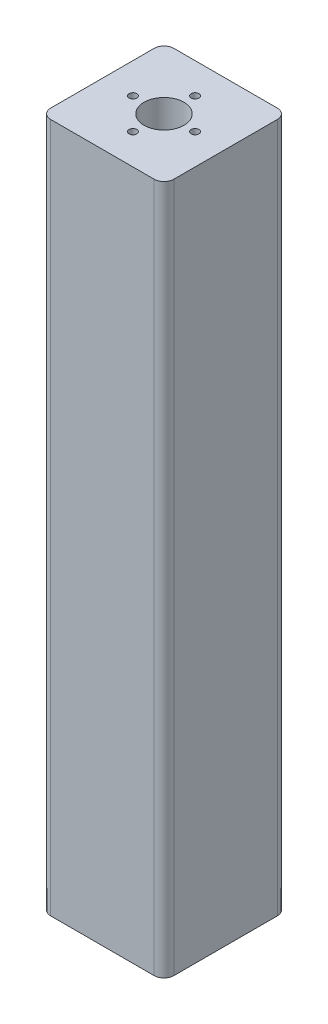
ISO-10303-21;
HEADER;
FILE_DESCRIPTION(('STEP AP214'),'2;1');
FILE_NAME('part.step','',(''),(''),'','','');
FILE_SCHEMA(('AUTOMOTIVE_DESIGN { 1 0 10303 214 1 1 1 1 }'));
ENDSEC;
DATA;
#1=APPLICATION_CONTEXT('core data for automotive mechanical design processes');
#2=APPLICATION_PROTOCOL_DEFINITION('international standard','automotive_design',2000,#1);
#3=PRODUCT_CONTEXT('',#1,'mechanical');
#4=PRODUCT('Part','Part','',(#3));
#5=PRODUCT_RELATED_PRODUCT_CATEGORY('part','',(#4));
#6=PRODUCT_DEFINITION_FORMATION('','',#4);
#7=PRODUCT_DEFINITION_CONTEXT('part definition',#1,'design');
#8=PRODUCT_DEFINITION('design','',#6,#7);
#9=PRODUCT_DEFINITION_SHAPE('','',#8);
#10=(LENGTH_UNIT() NAMED_UNIT(*) SI_UNIT(.MILLI.,.METRE.));
#11=(NAMED_UNIT(*) PLANE_ANGLE_UNIT() SI_UNIT($,.RADIAN.));
#12=(NAMED_UNIT(*) SI_UNIT($,.STERADIAN.) SOLID_ANGLE_UNIT());
#13=UNCERTAINTY_MEASURE_WITH_UNIT(LENGTH_MEASURE(1.E-05),#10,'distance_accuracy_value','');
#14=(GEOMETRIC_REPRESENTATION_CONTEXT(3) GLOBAL_UNCERTAINTY_ASSIGNED_CONTEXT((#13)) GLOBAL_UNIT_ASSIGNED_CONTEXT((#10,
#11,#12)) REPRESENTATION_CONTEXT('',''));
#15=CARTESIAN_POINT('',(0.,0.,0.));
#16=DIRECTION('',(0.,0.,1.));
#17=DIRECTION('',(1.,0.,0.));
#18=AXIS2_PLACEMENT_3D('',#15,#16,#17);
#19=CARTESIAN_POINT('',(-15.875,177.8,-15.875));
#20=DIRECTION('',(1.,0.,0.));
#21=DIRECTION('',(0.,0.,-1.));
#22=AXIS2_PLACEMENT_3D('',#19,#20,#21);
#23=PLANE('',#22);
#24=DIRECTION('',(0.,0.,1.));
#25=VECTOR('',#24,1.);
#26=CARTESIAN_POINT('',(-15.875,177.8,-15.875));
#27=LINE('',#26,#25);
#28=CARTESIAN_POINT('',(-15.875,177.8,-13.335));
#29=VERTEX_POINT('',#28);
#30=CARTESIAN_POINT('',(-15.875,177.8,13.335));
#31=VERTEX_POINT('',#30);
#32=EDGE_CURVE('E125',#29,#31,#27,.T.);
#33=ORIENTED_EDGE('',*,*,#32,.F.);
#34=DIRECTION('',(0.,-1.,0.));
#35=VECTOR('',#34,1.);
#36=CARTESIAN_POINT('',(-15.875,177.8,-13.335));
#37=LINE('',#36,#35);
#38=CARTESIAN_POINT('',(-15.875,0.,-13.335));
#39=VERTEX_POINT('',#38);
#40=EDGE_CURVE('E151',#29,#39,#37,.T.);
#41=ORIENTED_EDGE('',*,*,#40,.T.);
#42=DIRECTION('',(0.,0.,1.));
#43=VECTOR('',#42,1.);
#44=CARTESIAN_POINT('',(-15.875,0.,-15.875));
#45=LINE('',#44,#43);
#46=CARTESIAN_POINT('',(-15.875,0.,13.335));
#47=VERTEX_POINT('',#46);
#48=EDGE_CURVE('E160',#39,#47,#45,.T.);
#49=ORIENTED_EDGE('',*,*,#48,.T.);
#50=DIRECTION('',(0.,-1.,0.));
#51=VECTOR('',#50,1.);
#52=CARTESIAN_POINT('',(-15.875,177.8,13.335));
#53=LINE('',#52,#51);
#54=EDGE_CURVE('E149',#47,#31,#53,.F.);
#55=ORIENTED_EDGE('',*,*,#54,.T.);
#56=EDGE_LOOP('',(#33,#41,#49,#55));
#57=FACE_BOUND('',#56,.T.);
#58=ADVANCED_FACE('F33',(#57),#23,.F.);
#59=CARTESIAN_POINT('',(15.875,177.8,15.875));
#60=DIRECTION('',(0.,0.,-1.));
#61=DIRECTION('',(-1.,0.,0.));
#62=AXIS2_PLACEMENT_3D('',#59,#60,#61);
#63=PLANE('',#62);
#64=DIRECTION('',(1.,0.,0.));
#65=VECTOR('',#64,1.);
#66=CARTESIAN_POINT('',(15.875,0.,15.875));
#67=LINE('',#66,#65);
#68=CARTESIAN_POINT('',(-13.335,0.,15.875));
#69=VERTEX_POINT('',#68);
#70=CARTESIAN_POINT('',(13.335,0.,15.875));
#71=VERTEX_POINT('',#70);
#72=EDGE_CURVE('E130',#69,#71,#67,.T.);
#73=ORIENTED_EDGE('',*,*,#72,.T.);
#74=DIRECTION('',(0.,-1.,0.));
#75=VECTOR('',#74,1.);
#76=CARTESIAN_POINT('',(13.335,177.8,15.875));
#77=LINE('',#76,#75);
#78=CARTESIAN_POINT('',(13.335,177.8,15.875));
#79=VERTEX_POINT('',#78);
#80=EDGE_CURVE('E11',#71,#79,#77,.F.);
#81=ORIENTED_EDGE('',*,*,#80,.T.);
#82=DIRECTION('',(1.,0.,0.));
#83=VECTOR('',#82,1.);
#84=CARTESIAN_POINT('',(15.875,177.8,15.875));
#85=LINE('',#84,#83);
#86=CARTESIAN_POINT('',(-13.335,177.8,15.875));
#87=VERTEX_POINT('',#86);
#88=EDGE_CURVE('E128',#87,#79,#85,.T.);
#89=ORIENTED_EDGE('',*,*,#88,.F.);
#90=DIRECTION('',(0.,-1.,0.));
#91=VECTOR('',#90,1.);
#92=CARTESIAN_POINT('',(-13.335,177.8,15.875));
#93=LINE('',#92,#91);
#94=EDGE_CURVE('E42',#87,#69,#93,.T.);
#95=ORIENTED_EDGE('',*,*,#94,.T.);
#96=EDGE_LOOP('',(#73,#81,#89,#95));
#97=FACE_BOUND('',#96,.T.);
#98=ADVANCED_FACE('F157',(#97),#63,.F.);
#99=CARTESIAN_POINT('',(15.875,177.8,-15.875));
#100=DIRECTION('',(-1.,0.,0.));
#101=DIRECTION('',(0.,0.,1.));
#102=AXIS2_PLACEMENT_3D('',#99,#100,#101);
#103=PLANE('',#102);
#104=DIRECTION('',(0.,0.,-1.));
#105=VECTOR('',#104,1.);
#106=CARTESIAN_POINT('',(15.875,0.,-15.875));
#107=LINE('',#106,#105);
#108=CARTESIAN_POINT('',(15.875,0.,13.335));
#109=VERTEX_POINT('',#108);
#110=CARTESIAN_POINT('',(15.875,0.,-13.335));
#111=VERTEX_POINT('',#110);
#112=EDGE_CURVE('E126',#109,#111,#107,.T.);
#113=ORIENTED_EDGE('',*,*,#112,.T.);
#114=DIRECTION('',(0.,-1.,0.));
#115=VECTOR('',#114,1.);
#116=CARTESIAN_POINT('',(15.875,177.8,-13.335));
#117=LINE('',#116,#115);
#118=CARTESIAN_POINT('',(15.875,177.8,-13.335));
#119=VERTEX_POINT('',#118);
#120=EDGE_CURVE('E104',#111,#119,#117,.F.);
#121=ORIENTED_EDGE('',*,*,#120,.T.);
#122=DIRECTION('',(0.,0.,-1.));
#123=VECTOR('',#122,1.);
#124=CARTESIAN_POINT('',(15.875,177.8,-15.875));
#125=LINE('',#124,#123);
#126=CARTESIAN_POINT('',(15.875,177.8,13.335));
#127=VERTEX_POINT('',#126);
#128=EDGE_CURVE('E165',#127,#119,#125,.T.);
#129=ORIENTED_EDGE('',*,*,#128,.F.);
#130=DIRECTION('',(0.,-1.,0.));
#131=VECTOR('',#130,1.);
#132=CARTESIAN_POINT('',(15.875,177.8,13.335));
#133=LINE('',#132,#131);
#134=EDGE_CURVE('E109',#127,#109,#133,.T.);
#135=ORIENTED_EDGE('',*,*,#134,.T.);
#136=EDGE_LOOP('',(#113,#121,#129,#135));
#137=FACE_BOUND('',#136,.T.);
#138=ADVANCED_FACE('F234',(#137),#103,.F.);
#139=CARTESIAN_POINT('',(15.875,177.8,-15.875));
#140=DIRECTION('',(0.,0.,1.));
#141=DIRECTION('',(1.,0.,0.));
#142=AXIS2_PLACEMENT_3D('',#139,#140,#141);
#143=PLANE('',#142);
#144=DIRECTION('',(-1.,0.,0.));
#145=VECTOR('',#144,1.);
#146=CARTESIAN_POINT('',(15.875,177.8,-15.875));
#147=LINE('',#146,#145);
#148=CARTESIAN_POINT('',(13.335,177.8,-15.875));
#149=VERTEX_POINT('',#148);
#150=CARTESIAN_POINT('',(-13.335,177.8,-15.875));
#151=VERTEX_POINT('',#150);
#152=EDGE_CURVE('E119',#149,#151,#147,.T.);
#153=ORIENTED_EDGE('',*,*,#152,.F.);
#154=DIRECTION('',(0.,-1.,0.));
#155=VECTOR('',#154,1.);
#156=CARTESIAN_POINT('',(13.335,177.8,-15.875));
#157=LINE('',#156,#155);
#158=CARTESIAN_POINT('',(13.335,0.,-15.875));
#159=VERTEX_POINT('',#158);
#160=EDGE_CURVE('E103',#149,#159,#157,.T.);
#161=ORIENTED_EDGE('',*,*,#160,.T.);
#162=DIRECTION('',(-1.,0.,0.));
#163=VECTOR('',#162,1.);
#164=CARTESIAN_POINT('',(15.875,0.,-15.875));
#165=LINE('',#164,#163);
#166=CARTESIAN_POINT('',(-13.335,0.,-15.875));
#167=VERTEX_POINT('',#166);
#168=EDGE_CURVE('E116',#159,#167,#165,.T.);
#169=ORIENTED_EDGE('',*,*,#168,.T.);
#170=DIRECTION('',(0.,-1.,0.));
#171=VECTOR('',#170,1.);
#172=CARTESIAN_POINT('',(-13.335,177.8,-15.875));
#173=LINE('',#172,#171);
#174=EDGE_CURVE('E121',#167,#151,#173,.F.);
#175=ORIENTED_EDGE('',*,*,#174,.T.);
#176=EDGE_LOOP('',(#153,#161,#169,#175));
#177=FACE_BOUND('',#176,.T.);
#178=ADVANCED_FACE('F115',(#177),#143,.F.);
#179=CARTESIAN_POINT('',(0.,177.8,0.));
#180=DIRECTION('',(0.,-1.,0.));
#181=DIRECTION('',(0.,0.,-1.));
#182=AXIS2_PLACEMENT_3D('',#179,#180,#181);
#183=PLANE('',#182);
#184=CARTESIAN_POINT('',(0.,177.8,0.));
#185=DIRECTION('',(0.,1.,0.));
#186=DIRECTION('',(0.,0.,1.));
#187=AXIS2_PLACEMENT_3D('',#184,#185,#186);
#188=CIRCLE('',#187,5.15);
#189=CARTESIAN_POINT('',(0.,177.8,5.15));
#190=VERTEX_POINT('',#189);
#191=EDGE_CURVE('E193',#190,#190,#188,.T.);
#192=ORIENTED_EDGE('',*,*,#191,.F.);
#193=EDGE_LOOP('',(#192));
#194=FACE_BOUND('',#193,.T.);
#195=CARTESIAN_POINT('',(0.,177.8,-8.));
#196=DIRECTION('',(0.,1.,0.));
#197=DIRECTION('',(0.,0.,1.));
#198=AXIS2_PLACEMENT_3D('',#195,#196,#197);
#199=CIRCLE('',#198,1.);
#200=CARTESIAN_POINT('',(0.,177.8,-7.));
#201=VERTEX_POINT('',#200);
#202=EDGE_CURVE('E188',#201,#201,#199,.T.);
#203=ORIENTED_EDGE('',*,*,#202,.F.);
#204=EDGE_LOOP('',(#203));
#205=FACE_BOUND('',#204,.T.);
#206=CARTESIAN_POINT('',(0.,177.8,8.));
#207=DIRECTION('',(0.,1.,0.));
#208=DIRECTION('',(0.,0.,-1.));
#209=AXIS2_PLACEMENT_3D('',#206,#207,#208);
#210=CIRCLE('',#209,1.);
#211=CARTESIAN_POINT('',(0.,177.8,9.));
#212=VERTEX_POINT('',#211);
#213=EDGE_CURVE('E182',#212,#212,#210,.T.);
#214=ORIENTED_EDGE('',*,*,#213,.F.);
#215=EDGE_LOOP('',(#214));
#216=FACE_BOUND('',#215,.T.);
#217=CARTESIAN_POINT('',(-8.,177.8,0.));
#218=DIRECTION('',(0.,1.,0.));
#219=DIRECTION('',(0.,0.,1.));
#220=AXIS2_PLACEMENT_3D('',#217,#218,#219);
#221=CIRCLE('',#220,1.);
#222=CARTESIAN_POINT('',(-8.,177.8,1.));
#223=VERTEX_POINT('',#222);
#224=EDGE_CURVE('E176',#223,#223,#221,.T.);
#225=ORIENTED_EDGE('',*,*,#224,.F.);
#226=EDGE_LOOP('',(#225));
#227=FACE_BOUND('',#226,.T.);
#228=CARTESIAN_POINT('',(8.,177.8,0.));
#229=DIRECTION('',(0.,1.,0.));
#230=DIRECTION('',(0.,0.,1.));
#231=AXIS2_PLACEMENT_3D('',#228,#229,#230);
#232=CIRCLE('',#231,1.);
#233=CARTESIAN_POINT('',(8.,177.8,1.));
#234=VERTEX_POINT('',#233);
#235=EDGE_CURVE('E169',#234,#234,#232,.T.);
#236=ORIENTED_EDGE('',*,*,#235,.F.);
#237=EDGE_LOOP('',(#236));
#238=FACE_BOUND('',#237,.T.);
#239=ORIENTED_EDGE('',*,*,#128,.T.);
#240=CARTESIAN_POINT('',(13.335,177.8,-13.335));
#241=DIRECTION('',(0.,-1.,0.));
#242=DIRECTION('',(0.,0.,-1.));
#243=AXIS2_PLACEMENT_3D('',#240,#241,#242);
#244=CIRCLE('',#243,2.54);
#245=EDGE_CURVE('E147',#119,#149,#244,.F.);
#246=ORIENTED_EDGE('',*,*,#245,.T.);
#247=ORIENTED_EDGE('',*,*,#152,.T.);
#248=CARTESIAN_POINT('',(-13.335,177.8,-13.335));
#249=DIRECTION('',(0.,-1.,0.));
#250=DIRECTION('',(0.,0.,-1.));
#251=AXIS2_PLACEMENT_3D('',#248,#249,#250);
#252=CIRCLE('',#251,2.54);
#253=EDGE_CURVE('E145',#151,#29,#252,.F.);
#254=ORIENTED_EDGE('',*,*,#253,.T.);
#255=ORIENTED_EDGE('',*,*,#32,.T.);
#256=CARTESIAN_POINT('',(-13.335,177.8,13.335));
#257=DIRECTION('',(0.,-1.,0.));
#258=DIRECTION('',(0.,0.,-1.));
#259=AXIS2_PLACEMENT_3D('',#256,#257,#258);
#260=CIRCLE('',#259,2.54);
#261=EDGE_CURVE('E54',#31,#87,#260,.F.);
#262=ORIENTED_EDGE('',*,*,#261,.T.);
#263=ORIENTED_EDGE('',*,*,#88,.T.);
#264=CARTESIAN_POINT('',(13.335,177.8,13.335));
#265=DIRECTION('',(0.,-1.,0.));
#266=DIRECTION('',(0.,0.,-1.));
#267=AXIS2_PLACEMENT_3D('',#264,#265,#266);
#268=CIRCLE('',#267,2.54);
#269=EDGE_CURVE('E143',#79,#127,#268,.F.);
#270=ORIENTED_EDGE('',*,*,#269,.T.);
#271=EDGE_LOOP('',(#239,#246,#247,#254,#255,#262,#263,#270));
#272=FACE_BOUND('',#271,.T.);
#273=ADVANCED_FACE('F219',(#194,#205,#216,#227,#238,#272),#183,.F.);
#274=CARTESIAN_POINT('',(0.,0.,0.));
#275=DIRECTION('',(0.,-1.,0.));
#276=DIRECTION('',(0.,0.,-1.));
#277=AXIS2_PLACEMENT_3D('',#274,#275,#276);
#278=PLANE('',#277);
#279=CARTESIAN_POINT('',(0.,0.,0.));
#280=DIRECTION('',(0.,-1.,0.));
#281=DIRECTION('',(0.,0.,-1.));
#282=AXIS2_PLACEMENT_3D('',#279,#280,#281);
#283=CIRCLE('',#282,1.);
#284=CARTESIAN_POINT('',(0.,0.,-1.));
#285=VERTEX_POINT('',#284);
#286=EDGE_CURVE('E198',#285,#285,#283,.T.);
#287=ORIENTED_EDGE('',*,*,#286,.F.);
#288=EDGE_LOOP('',(#287));
#289=FACE_BOUND('',#288,.T.);
#290=ORIENTED_EDGE('',*,*,#168,.F.);
#291=CARTESIAN_POINT('',(13.335,0.,-13.335));
#292=DIRECTION('',(0.,-1.,0.));
#293=DIRECTION('',(0.,0.,-1.));
#294=AXIS2_PLACEMENT_3D('',#291,#292,#293);
#295=CIRCLE('',#294,2.54);
#296=EDGE_CURVE('E99',#159,#111,#295,.T.);
#297=ORIENTED_EDGE('',*,*,#296,.T.);
#298=ORIENTED_EDGE('',*,*,#112,.F.);
#299=CARTESIAN_POINT('',(13.335,0.,13.335));
#300=DIRECTION('',(0.,-1.,0.));
#301=DIRECTION('',(0.,0.,-1.));
#302=AXIS2_PLACEMENT_3D('',#299,#300,#301);
#303=CIRCLE('',#302,2.54);
#304=EDGE_CURVE('E136',#109,#71,#303,.T.);
#305=ORIENTED_EDGE('',*,*,#304,.T.);
#306=ORIENTED_EDGE('',*,*,#72,.F.);
#307=CARTESIAN_POINT('',(-13.335,0.,13.335));
#308=DIRECTION('',(0.,-1.,0.));
#309=DIRECTION('',(0.,0.,-1.));
#310=AXIS2_PLACEMENT_3D('',#307,#308,#309);
#311=CIRCLE('',#310,2.54);
#312=EDGE_CURVE('E120',#69,#47,#311,.T.);
#313=ORIENTED_EDGE('',*,*,#312,.T.);
#314=ORIENTED_EDGE('',*,*,#48,.F.);
#315=CARTESIAN_POINT('',(-13.335,0.,-13.335));
#316=DIRECTION('',(0.,-1.,0.));
#317=DIRECTION('',(0.,0.,-1.));
#318=AXIS2_PLACEMENT_3D('',#315,#316,#317);
#319=CIRCLE('',#318,2.54);
#320=EDGE_CURVE('E110',#39,#167,#319,.T.);
#321=ORIENTED_EDGE('',*,*,#320,.T.);
#322=EDGE_LOOP('',(#290,#297,#298,#305,#306,#313,#314,#321));
#323=FACE_BOUND('',#322,.T.);
#324=ADVANCED_FACE('F123',(#289,#323),#278,.T.);
#325=CARTESIAN_POINT('',(8.,139.7,0.));
#326=DIRECTION('',(0.,1.,0.));
#327=DIRECTION('',(0.,0.,1.));
#328=AXIS2_PLACEMENT_3D('',#325,#326,#327);
#329=CYLINDRICAL_SURFACE('',#328,1.);
#330=CARTESIAN_POINT('',(8.,139.7,0.));
#331=DIRECTION('',(0.,1.,0.));
#332=DIRECTION('',(0.,0.,1.));
#333=AXIS2_PLACEMENT_3D('',#330,#331,#332);
#334=CIRCLE('',#333,1.);
#335=CARTESIAN_POINT('',(8.,139.7,1.));
#336=VERTEX_POINT('',#335);
#337=EDGE_CURVE('E172',#336,#336,#334,.T.);
#338=CARTESIAN_POINT('',(8.,139.7,1.));
#339=CARTESIAN_POINT('',(8.,140.096875,1.));
#340=CARTESIAN_POINT('',(8.,140.49375,1.));
#341=CARTESIAN_POINT('',(8.,141.2875,1.));
#342=CARTESIAN_POINT('',(8.,141.684375,1.));
#343=CARTESIAN_POINT('',(8.,142.478125,1.));
#344=CARTESIAN_POINT('',(8.,142.875,1.));
#345=CARTESIAN_POINT('',(8.,143.66875,1.));
#346=CARTESIAN_POINT('',(8.,144.065625,1.));
#347=CARTESIAN_POINT('',(8.,144.859375,1.));
#348=CARTESIAN_POINT('',(8.,145.25625,1.));
#349=CARTESIAN_POINT('',(8.,146.05,1.));
#350=CARTESIAN_POINT('',(8.,146.446875,1.));
#351=CARTESIAN_POINT('',(8.,147.240625,1.));
#352=CARTESIAN_POINT('',(8.,147.6375,1.));
#353=CARTESIAN_POINT('',(8.,148.43125,1.));
#354=CARTESIAN_POINT('',(8.,148.828125,1.));
#355=CARTESIAN_POINT('',(8.,149.621875,1.));
#356=CARTESIAN_POINT('',(8.,150.01875,1.));
#357=CARTESIAN_POINT('',(8.,150.8125,1.));
#358=CARTESIAN_POINT('',(8.,151.209375,1.));
#359=CARTESIAN_POINT('',(8.,152.003125,1.));
#360=CARTESIAN_POINT('',(8.,152.4,1.));
#361=CARTESIAN_POINT('',(8.,153.19375,1.));
#362=CARTESIAN_POINT('',(8.,153.590625,1.));
#363=CARTESIAN_POINT('',(8.,154.384375,1.));
#364=CARTESIAN_POINT('',(8.,154.78125,1.));
#365=CARTESIAN_POINT('',(8.,155.575,1.));
#366=CARTESIAN_POINT('',(8.,155.971875,1.));
#367=CARTESIAN_POINT('',(8.,156.765625,1.));
#368=CARTESIAN_POINT('',(8.,157.1625,1.));
#369=CARTESIAN_POINT('',(8.,157.95625,1.));
#370=CARTESIAN_POINT('',(8.,158.353125,1.));
#371=CARTESIAN_POINT('',(8.,159.146875,1.));
#372=CARTESIAN_POINT('',(8.,159.54375,1.));
#373=CARTESIAN_POINT('',(8.,160.3375,1.));
#374=CARTESIAN_POINT('',(8.,160.734375,1.));
#375=CARTESIAN_POINT('',(8.,161.528125,1.));
#376=CARTESIAN_POINT('',(8.,161.925,1.));
#377=CARTESIAN_POINT('',(8.,162.71875,1.));
#378=CARTESIAN_POINT('',(8.,163.115625,1.));
#379=CARTESIAN_POINT('',(8.,163.909375,1.));
#380=CARTESIAN_POINT('',(8.,164.30625,1.));
#381=CARTESIAN_POINT('',(8.,165.1,1.));
#382=CARTESIAN_POINT('',(8.,165.496875,1.));
#383=CARTESIAN_POINT('',(8.,166.290625,1.));
#384=CARTESIAN_POINT('',(8.,166.6875,1.));
#385=CARTESIAN_POINT('',(8.,167.48125,1.));
#386=CARTESIAN_POINT('',(8.,167.878125,1.));
#387=CARTESIAN_POINT('',(8.,168.671875,1.));
#388=CARTESIAN_POINT('',(8.,169.06875,1.));
#389=CARTESIAN_POINT('',(8.,169.8625,1.));
#390=CARTESIAN_POINT('',(8.,170.259375,1.));
#391=CARTESIAN_POINT('',(8.,171.053125,1.));
#392=CARTESIAN_POINT('',(8.,171.45,1.));
#393=CARTESIAN_POINT('',(8.,172.24375,1.));
#394=CARTESIAN_POINT('',(8.,172.640625,1.));
#395=CARTESIAN_POINT('',(8.,173.434375,1.));
#396=CARTESIAN_POINT('',(8.,173.83125,1.));
#397=CARTESIAN_POINT('',(8.,174.625,1.));
#398=CARTESIAN_POINT('',(8.,175.021875,1.));
#399=CARTESIAN_POINT('',(8.,175.815625,1.));
#400=CARTESIAN_POINT('',(8.,176.2125,1.));
#401=CARTESIAN_POINT('',(8.,177.00625,1.));
#402=CARTESIAN_POINT('',(8.,177.403125,1.));
#403=CARTESIAN_POINT('',(8.,177.8,1.));
#404=B_SPLINE_CURVE_WITH_KNOTS('',3,(#338,#339,#340,#341,#342,#343,#344,#345,#346,#347,#348,
#349,#350,#351,#352,#353,#354,#355,#356,#357,#358,#359,#360,#361,#362,#363,#364,#365,#366,#367,
#368,#369,#370,#371,#372,#373,#374,#375,#376,#377,#378,#379,#380,#381,#382,#383,#384,#385,#386,
#387,#388,#389,#390,#391,#392,#393,#394,#395,#396,#397,#398,#399,#400,#401,#402,#403),
.UNSPECIFIED.,.F.,.F.,(4,2,2,2,2,2,2,2,2,2,2,2,2,2,2,2,2,2,2,2,2,2,2,2,2,2,2,2,2,2,2,2,4),(0.,
1.19062499999997,2.38124999999997,3.57187499999997,4.76249999999998,5.95312499999998,
7.14374999999998,8.33437499999998,9.52499999999998,10.715625,11.90625,13.096875,14.2875,
15.478125,16.66875,17.859375,19.05,20.240625,21.43125,22.621875,23.8125,25.003125,26.19375,
27.384375,28.575,29.765625,30.95625,32.146875,33.3375,34.528125,35.71875,36.909375,38.1),.UNSPECIFIED.);
#405=EDGE_CURVE('BSEAM288',#336,#234,#404,.T.);
#406=ORIENTED_EDGE('',*,*,#337,.F.);
#407=ORIENTED_EDGE('',*,*,#235,.T.);
#408=ORIENTED_EDGE('',*,*,#405,.T.);
#409=ORIENTED_EDGE('',*,*,#405,.F.);
#410=EDGE_LOOP('',(#406,#408,#407,#409));
#411=FACE_BOUND('',#410,.T.);
#412=ADVANCED_FACE('F288',(#411),#329,.F.);
#413=CARTESIAN_POINT('',(8.,139.7,0.));
#414=DIRECTION('',(0.,1.,0.));
#415=DIRECTION('',(0.,0.,1.));
#416=AXIS2_PLACEMENT_3D('',#413,#414,#415);
#417=PLANE('',#416);
#418=ORIENTED_EDGE('',*,*,#337,.T.);
#419=EDGE_LOOP('',(#418));
#420=FACE_BOUND('',#419,.T.);
#421=ADVANCED_FACE('F284',(#420),#417,.T.);
#422=CARTESIAN_POINT('',(-8.,139.7,0.));
#423=DIRECTION('',(0.,1.,0.));
#424=DIRECTION('',(0.,0.,1.));
#425=AXIS2_PLACEMENT_3D('',#422,#423,#424);
#426=CYLINDRICAL_SURFACE('',#425,1.);
#427=CARTESIAN_POINT('',(-8.,139.7,0.));
#428=DIRECTION('',(0.,1.,0.));
#429=DIRECTION('',(0.,0.,1.));
#430=AXIS2_PLACEMENT_3D('',#427,#428,#429);
#431=CIRCLE('',#430,1.);
#432=CARTESIAN_POINT('',(-8.,139.7,1.));
#433=VERTEX_POINT('',#432);
#434=EDGE_CURVE('E179',#433,#433,#431,.T.);
#435=CARTESIAN_POINT('',(-8.,139.7,1.));
#436=CARTESIAN_POINT('',(-8.,140.096875,1.));
#437=CARTESIAN_POINT('',(-8.,140.49375,1.));
#438=CARTESIAN_POINT('',(-8.,141.2875,1.));
#439=CARTESIAN_POINT('',(-8.,141.684375,1.));
#440=CARTESIAN_POINT('',(-8.,142.478125,1.));
#441=CARTESIAN_POINT('',(-8.,142.875,1.));
#442=CARTESIAN_POINT('',(-8.,143.66875,1.));
#443=CARTESIAN_POINT('',(-8.,144.065625,1.));
#444=CARTESIAN_POINT('',(-8.,144.859375,1.));
#445=CARTESIAN_POINT('',(-8.,145.25625,1.));
#446=CARTESIAN_POINT('',(-8.,146.05,1.));
#447=CARTESIAN_POINT('',(-8.,146.446875,1.));
#448=CARTESIAN_POINT('',(-8.,147.240625,1.));
#449=CARTESIAN_POINT('',(-8.,147.6375,1.));
#450=CARTESIAN_POINT('',(-8.,148.43125,1.));
#451=CARTESIAN_POINT('',(-8.,148.828125,1.));
#452=CARTESIAN_POINT('',(-8.,149.621875,1.));
#453=CARTESIAN_POINT('',(-8.,150.01875,1.));
#454=CARTESIAN_POINT('',(-8.,150.8125,1.));
#455=CARTESIAN_POINT('',(-8.,151.209375,1.));
#456=CARTESIAN_POINT('',(-8.,152.003125,1.));
#457=CARTESIAN_POINT('',(-8.,152.4,1.));
#458=CARTESIAN_POINT('',(-8.,153.19375,1.));
#459=CARTESIAN_POINT('',(-8.,153.590625,1.));
#460=CARTESIAN_POINT('',(-8.,154.384375,1.));
#461=CARTESIAN_POINT('',(-8.,154.78125,1.));
#462=CARTESIAN_POINT('',(-8.,155.575,1.));
#463=CARTESIAN_POINT('',(-8.,155.971875,1.));
#464=CARTESIAN_POINT('',(-8.,156.765625,1.));
#465=CARTESIAN_POINT('',(-8.,157.1625,1.));
#466=CARTESIAN_POINT('',(-8.,157.95625,1.));
#467=CARTESIAN_POINT('',(-8.,158.353125,1.));
#468=CARTESIAN_POINT('',(-8.,159.146875,1.));
#469=CARTESIAN_POINT('',(-8.,159.54375,1.));
#470=CARTESIAN_POINT('',(-8.,160.3375,1.));
#471=CARTESIAN_POINT('',(-8.,160.734375,1.));
#472=CARTESIAN_POINT('',(-8.,161.528125,1.));
#473=CARTESIAN_POINT('',(-8.,161.925,1.));
#474=CARTESIAN_POINT('',(-8.,162.71875,1.));
#475=CARTESIAN_POINT('',(-8.,163.115625,1.));
#476=CARTESIAN_POINT('',(-8.,163.909375,1.));
#477=CARTESIAN_POINT('',(-8.,164.30625,1.));
#478=CARTESIAN_POINT('',(-8.,165.1,1.));
#479=CARTESIAN_POINT('',(-8.,165.496875,1.));
#480=CARTESIAN_POINT('',(-8.,166.290625,1.));
#481=CARTESIAN_POINT('',(-8.,166.6875,1.));
#482=CARTESIAN_POINT('',(-8.,167.48125,1.));
#483=CARTESIAN_POINT('',(-8.,167.878125,1.));
#484=CARTESIAN_POINT('',(-8.,168.671875,1.));
#485=CARTESIAN_POINT('',(-8.,169.06875,1.));
#486=CARTESIAN_POINT('',(-8.,169.8625,1.));
#487=CARTESIAN_POINT('',(-8.,170.259375,1.));
#488=CARTESIAN_POINT('',(-8.,171.053125,1.));
#489=CARTESIAN_POINT('',(-8.,171.45,1.));
#490=CARTESIAN_POINT('',(-8.,172.24375,1.));
#491=CARTESIAN_POINT('',(-8.,172.640625,1.));
#492=CARTESIAN_POINT('',(-8.,173.434375,1.));
#493=CARTESIAN_POINT('',(-8.,173.83125,1.));
#494=CARTESIAN_POINT('',(-8.,174.625,1.));
#495=CARTESIAN_POINT('',(-8.,175.021875,1.));
#496=CARTESIAN_POINT('',(-8.,175.815625,1.));
#497=CARTESIAN_POINT('',(-8.,176.2125,1.));
#498=CARTESIAN_POINT('',(-8.,177.00625,1.));
#499=CARTESIAN_POINT('',(-8.,177.403125,1.));
#500=CARTESIAN_POINT('',(-8.,177.8,1.));
#501=B_SPLINE_CURVE_WITH_KNOTS('',3,(#435,#436,#437,#438,#439,#440,#441,#442,#443,#444,#445,
#446,#447,#448,#449,#450,#451,#452,#453,#454,#455,#456,#457,#458,#459,#460,#461,#462,#463,#464,
#465,#466,#467,#468,#469,#470,#471,#472,#473,#474,#475,#476,#477,#478,#479,#480,#481,#482,#483,
#484,#485,#486,#487,#488,#489,#490,#491,#492,#493,#494,#495,#496,#497,#498,#499,#500),
.UNSPECIFIED.,.F.,.F.,(4,2,2,2,2,2,2,2,2,2,2,2,2,2,2,2,2,2,2,2,2,2,2,2,2,2,2,2,2,2,2,2,4),(0.,
1.19062499999997,2.38124999999997,3.57187499999997,4.76249999999998,5.95312499999998,
7.14374999999998,8.33437499999998,9.52499999999998,10.715625,11.90625,13.096875,14.2875,
15.478125,16.66875,17.859375,19.05,20.240625,21.43125,22.621875,23.8125,25.003125,26.19375,
27.384375,28.575,29.765625,30.95625,32.146875,33.3375,34.528125,35.71875,36.909375,38.1),.UNSPECIFIED.);
#502=EDGE_CURVE('BSEAM280',#433,#223,#501,.T.);
#503=ORIENTED_EDGE('',*,*,#434,.F.);
#504=ORIENTED_EDGE('',*,*,#224,.T.);
#505=ORIENTED_EDGE('',*,*,#502,.T.);
#506=ORIENTED_EDGE('',*,*,#502,.F.);
#507=EDGE_LOOP('',(#503,#505,#504,#506));
#508=FACE_BOUND('',#507,.T.);
#509=ADVANCED_FACE('F280',(#508),#426,.F.);
#510=CARTESIAN_POINT('',(-8.,139.7,0.));
#511=DIRECTION('',(0.,1.,0.));
#512=DIRECTION('',(0.,0.,1.));
#513=AXIS2_PLACEMENT_3D('',#510,#511,#512);
#514=PLANE('',#513);
#515=ORIENTED_EDGE('',*,*,#434,.T.);
#516=EDGE_LOOP('',(#515));
#517=FACE_BOUND('',#516,.T.);
#518=ADVANCED_FACE('F276',(#517),#514,.T.);
#519=CARTESIAN_POINT('',(0.,139.7,8.));
#520=DIRECTION('',(0.,1.,0.));
#521=DIRECTION('',(0.,0.,1.));
#522=AXIS2_PLACEMENT_3D('',#519,#520,#521);
#523=CYLINDRICAL_SURFACE('',#522,1.);
#524=CARTESIAN_POINT('',(0.,139.7,8.));
#525=DIRECTION('',(0.,1.,0.));
#526=DIRECTION('',(0.,0.,-1.));
#527=AXIS2_PLACEMENT_3D('',#524,#525,#526);
#528=CIRCLE('',#527,1.);
#529=CARTESIAN_POINT('',(0.,139.7,9.));
#530=VERTEX_POINT('',#529);
#531=EDGE_CURVE('E185',#530,#530,#528,.T.);
#532=CARTESIAN_POINT('',(0.,139.7,9.));
#533=CARTESIAN_POINT('',(0.,140.096875,9.));
#534=CARTESIAN_POINT('',(0.,140.49375,9.));
#535=CARTESIAN_POINT('',(0.,141.2875,9.));
#536=CARTESIAN_POINT('',(0.,141.684375,9.));
#537=CARTESIAN_POINT('',(0.,142.478125,9.));
#538=CARTESIAN_POINT('',(0.,142.875,9.));
#539=CARTESIAN_POINT('',(0.,143.66875,9.));
#540=CARTESIAN_POINT('',(0.,144.065625,9.));
#541=CARTESIAN_POINT('',(0.,144.859375,9.));
#542=CARTESIAN_POINT('',(0.,145.25625,9.));
#543=CARTESIAN_POINT('',(0.,146.05,9.));
#544=CARTESIAN_POINT('',(0.,146.446875,9.));
#545=CARTESIAN_POINT('',(0.,147.240625,9.));
#546=CARTESIAN_POINT('',(0.,147.6375,9.));
#547=CARTESIAN_POINT('',(0.,148.43125,9.));
#548=CARTESIAN_POINT('',(0.,148.828125,9.));
#549=CARTESIAN_POINT('',(0.,149.621875,9.));
#550=CARTESIAN_POINT('',(0.,150.01875,9.));
#551=CARTESIAN_POINT('',(0.,150.8125,9.));
#552=CARTESIAN_POINT('',(0.,151.209375,9.));
#553=CARTESIAN_POINT('',(0.,152.003125,9.));
#554=CARTESIAN_POINT('',(0.,152.4,9.));
#555=CARTESIAN_POINT('',(0.,153.19375,9.));
#556=CARTESIAN_POINT('',(0.,153.590625,9.));
#557=CARTESIAN_POINT('',(0.,154.384375,9.));
#558=CARTESIAN_POINT('',(0.,154.78125,9.));
#559=CARTESIAN_POINT('',(0.,155.575,9.));
#560=CARTESIAN_POINT('',(0.,155.971875,9.));
#561=CARTESIAN_POINT('',(0.,156.765625,9.));
#562=CARTESIAN_POINT('',(0.,157.1625,9.));
#563=CARTESIAN_POINT('',(0.,157.95625,9.));
#564=CARTESIAN_POINT('',(0.,158.353125,9.));
#565=CARTESIAN_POINT('',(0.,159.146875,9.));
#566=CARTESIAN_POINT('',(0.,159.54375,9.));
#567=CARTESIAN_POINT('',(0.,160.3375,9.));
#568=CARTESIAN_POINT('',(0.,160.734375,9.));
#569=CARTESIAN_POINT('',(0.,161.528125,9.));
#570=CARTESIAN_POINT('',(0.,161.925,9.));
#571=CARTESIAN_POINT('',(0.,162.71875,9.));
#572=CARTESIAN_POINT('',(0.,163.115625,9.));
#573=CARTESIAN_POINT('',(0.,163.909375,9.));
#574=CARTESIAN_POINT('',(0.,164.30625,9.));
#575=CARTESIAN_POINT('',(0.,165.1,9.));
#576=CARTESIAN_POINT('',(0.,165.496875,9.));
#577=CARTESIAN_POINT('',(0.,166.290625,9.));
#578=CARTESIAN_POINT('',(0.,166.6875,9.));
#579=CARTESIAN_POINT('',(0.,167.48125,9.));
#580=CARTESIAN_POINT('',(0.,167.878125,9.));
#581=CARTESIAN_POINT('',(0.,168.671875,9.));
#582=CARTESIAN_POINT('',(0.,169.06875,9.));
#583=CARTESIAN_POINT('',(0.,169.8625,9.));
#584=CARTESIAN_POINT('',(0.,170.259375,9.));
#585=CARTESIAN_POINT('',(0.,171.053125,9.));
#586=CARTESIAN_POINT('',(0.,171.45,9.));
#587=CARTESIAN_POINT('',(0.,172.24375,9.));
#588=CARTESIAN_POINT('',(0.,172.640625,9.));
#589=CARTESIAN_POINT('',(0.,173.434375,9.));
#590=CARTESIAN_POINT('',(0.,173.83125,9.));
#591=CARTESIAN_POINT('',(0.,174.625,9.));
#592=CARTESIAN_POINT('',(0.,175.021875,9.));
#593=CARTESIAN_POINT('',(0.,175.815625,9.));
#594=CARTESIAN_POINT('',(0.,176.2125,9.));
#595=CARTESIAN_POINT('',(0.,177.00625,9.));
#596=CARTESIAN_POINT('',(0.,177.403125,9.));
#597=CARTESIAN_POINT('',(0.,177.8,9.));
#598=B_SPLINE_CURVE_WITH_KNOTS('',3,(#532,#533,#534,#535,#536,#537,#538,#539,#540,#541,#542,
#543,#544,#545,#546,#547,#548,#549,#550,#551,#552,#553,#554,#555,#556,#557,#558,#559,#560,#561,
#562,#563,#564,#565,#566,#567,#568,#569,#570,#571,#572,#573,#574,#575,#576,#577,#578,#579,#580,
#581,#582,#583,#584,#585,#586,#587,#588,#589,#590,#591,#592,#593,#594,#595,#596,#597),
.UNSPECIFIED.,.F.,.F.,(4,2,2,2,2,2,2,2,2,2,2,2,2,2,2,2,2,2,2,2,2,2,2,2,2,2,2,2,2,2,2,2,4),(0.,
1.19062499999997,2.38124999999997,3.57187499999997,4.76249999999998,5.95312499999998,
7.14374999999998,8.33437499999998,9.52499999999998,10.715625,11.90625,13.096875,14.2875,
15.478125,16.66875,17.859375,19.05,20.240625,21.43125,22.621875,23.8125,25.003125,26.19375,
27.384375,28.575,29.765625,30.95625,32.146875,33.3375,34.528125,35.71875,36.909375,38.1),.UNSPECIFIED.);
#599=EDGE_CURVE('BSEAM272',#530,#212,#598,.T.);
#600=ORIENTED_EDGE('',*,*,#531,.F.);
#601=ORIENTED_EDGE('',*,*,#213,.T.);
#602=ORIENTED_EDGE('',*,*,#599,.T.);
#603=ORIENTED_EDGE('',*,*,#599,.F.);
#604=EDGE_LOOP('',(#600,#602,#601,#603));
#605=FACE_BOUND('',#604,.T.);
#606=ADVANCED_FACE('F272',(#605),#523,.F.);
#607=CARTESIAN_POINT('',(0.,139.7,8.));
#608=DIRECTION('',(0.,-1.,0.));
#609=DIRECTION('',(0.,0.,-1.));
#610=AXIS2_PLACEMENT_3D('',#607,#608,#609);
#611=PLANE('',#610);
#612=ORIENTED_EDGE('',*,*,#531,.T.);
#613=EDGE_LOOP('',(#612));
#614=FACE_BOUND('',#613,.T.);
#615=ADVANCED_FACE('F266',(#614),#611,.F.);
#616=CARTESIAN_POINT('',(0.,139.7,-8.));
#617=DIRECTION('',(0.,1.,0.));
#618=DIRECTION('',(0.,0.,1.));
#619=AXIS2_PLACEMENT_3D('',#616,#617,#618);
#620=CYLINDRICAL_SURFACE('',#619,1.);
#621=CARTESIAN_POINT('',(0.,139.7,-8.));
#622=DIRECTION('',(0.,1.,0.));
#623=DIRECTION('',(0.,0.,1.));
#624=AXIS2_PLACEMENT_3D('',#621,#622,#623);
#625=CIRCLE('',#624,1.);
#626=CARTESIAN_POINT('',(0.,139.7,-7.));
#627=VERTEX_POINT('',#626);
#628=EDGE_CURVE('E161',#627,#627,#625,.T.);
#629=CARTESIAN_POINT('',(0.,139.7,-7.));
#630=CARTESIAN_POINT('',(0.,140.096875,-7.));
#631=CARTESIAN_POINT('',(0.,140.49375,-7.));
#632=CARTESIAN_POINT('',(0.,141.2875,-7.));
#633=CARTESIAN_POINT('',(0.,141.684375,-7.));
#634=CARTESIAN_POINT('',(0.,142.478125,-7.));
#635=CARTESIAN_POINT('',(0.,142.875,-7.));
#636=CARTESIAN_POINT('',(0.,143.66875,-7.));
#637=CARTESIAN_POINT('',(0.,144.065625,-7.));
#638=CARTESIAN_POINT('',(0.,144.859375,-7.));
#639=CARTESIAN_POINT('',(0.,145.25625,-7.));
#640=CARTESIAN_POINT('',(0.,146.05,-7.));
#641=CARTESIAN_POINT('',(0.,146.446875,-7.));
#642=CARTESIAN_POINT('',(0.,147.240625,-7.));
#643=CARTESIAN_POINT('',(0.,147.6375,-7.));
#644=CARTESIAN_POINT('',(0.,148.43125,-7.));
#645=CARTESIAN_POINT('',(0.,148.828125,-7.));
#646=CARTESIAN_POINT('',(0.,149.621875,-7.));
#647=CARTESIAN_POINT('',(0.,150.01875,-7.));
#648=CARTESIAN_POINT('',(0.,150.8125,-7.));
#649=CARTESIAN_POINT('',(0.,151.209375,-7.));
#650=CARTESIAN_POINT('',(0.,152.003125,-7.));
#651=CARTESIAN_POINT('',(0.,152.4,-7.));
#652=CARTESIAN_POINT('',(0.,153.19375,-7.));
#653=CARTESIAN_POINT('',(0.,153.590625,-7.));
#654=CARTESIAN_POINT('',(0.,154.384375,-7.));
#655=CARTESIAN_POINT('',(0.,154.78125,-7.));
#656=CARTESIAN_POINT('',(0.,155.575,-7.));
#657=CARTESIAN_POINT('',(0.,155.971875,-7.));
#658=CARTESIAN_POINT('',(0.,156.765625,-7.));
#659=CARTESIAN_POINT('',(0.,157.1625,-7.));
#660=CARTESIAN_POINT('',(0.,157.95625,-7.));
#661=CARTESIAN_POINT('',(0.,158.353125,-7.));
#662=CARTESIAN_POINT('',(0.,159.146875,-7.));
#663=CARTESIAN_POINT('',(0.,159.54375,-7.));
#664=CARTESIAN_POINT('',(0.,160.3375,-7.));
#665=CARTESIAN_POINT('',(0.,160.734375,-7.));
#666=CARTESIAN_POINT('',(0.,161.528125,-7.));
#667=CARTESIAN_POINT('',(0.,161.925,-7.));
#668=CARTESIAN_POINT('',(0.,162.71875,-7.));
#669=CARTESIAN_POINT('',(0.,163.115625,-7.));
#670=CARTESIAN_POINT('',(0.,163.909375,-7.));
#671=CARTESIAN_POINT('',(0.,164.30625,-7.));
#672=CARTESIAN_POINT('',(0.,165.1,-7.));
#673=CARTESIAN_POINT('',(0.,165.496875,-7.));
#674=CARTESIAN_POINT('',(0.,166.290625,-7.));
#675=CARTESIAN_POINT('',(0.,166.6875,-7.));
#676=CARTESIAN_POINT('',(0.,167.48125,-7.));
#677=CARTESIAN_POINT('',(0.,167.878125,-7.));
#678=CARTESIAN_POINT('',(0.,168.671875,-7.));
#679=CARTESIAN_POINT('',(0.,169.06875,-7.));
#680=CARTESIAN_POINT('',(0.,169.8625,-7.));
#681=CARTESIAN_POINT('',(0.,170.259375,-7.));
#682=CARTESIAN_POINT('',(0.,171.053125,-7.));
#683=CARTESIAN_POINT('',(0.,171.45,-7.));
#684=CARTESIAN_POINT('',(0.,172.24375,-7.));
#685=CARTESIAN_POINT('',(0.,172.640625,-7.));
#686=CARTESIAN_POINT('',(0.,173.434375,-7.));
#687=CARTESIAN_POINT('',(0.,173.83125,-7.));
#688=CARTESIAN_POINT('',(0.,174.625,-7.));
#689=CARTESIAN_POINT('',(0.,175.021875,-7.));
#690=CARTESIAN_POINT('',(0.,175.815625,-7.));
#691=CARTESIAN_POINT('',(0.,176.2125,-7.));
#692=CARTESIAN_POINT('',(0.,177.00625,-7.));
#693=CARTESIAN_POINT('',(0.,177.403125,-7.));
#694=CARTESIAN_POINT('',(0.,177.8,-7.));
#695=B_SPLINE_CURVE_WITH_KNOTS('',3,(#629,#630,#631,#632,#633,#634,#635,#636,#637,#638,#639,
#640,#641,#642,#643,#644,#645,#646,#647,#648,#649,#650,#651,#652,#653,#654,#655,#656,#657,#658,
#659,#660,#661,#662,#663,#664,#665,#666,#667,#668,#669,#670,#671,#672,#673,#674,#675,#676,#677,
#678,#679,#680,#681,#682,#683,#684,#685,#686,#687,#688,#689,#690,#691,#692,#693,#694),
.UNSPECIFIED.,.F.,.F.,(4,2,2,2,2,2,2,2,2,2,2,2,2,2,2,2,2,2,2,2,2,2,2,2,2,2,2,2,2,2,2,2,4),(0.,
1.19062499999997,2.38124999999997,3.57187499999997,4.76249999999998,5.95312499999998,
7.14374999999998,8.33437499999998,9.52499999999998,10.715625,11.90625,13.096875,14.2875,
15.478125,16.66875,17.859375,19.05,20.240625,21.43125,22.621875,23.8125,25.003125,26.19375,
27.384375,28.575,29.765625,30.95625,32.146875,33.3375,34.528125,35.71875,36.909375,38.1),.UNSPECIFIED.);
#696=EDGE_CURVE('BSEAM260',#627,#201,#695,.T.);
#697=ORIENTED_EDGE('',*,*,#628,.F.);
#698=ORIENTED_EDGE('',*,*,#202,.T.);
#699=ORIENTED_EDGE('',*,*,#696,.T.);
#700=ORIENTED_EDGE('',*,*,#696,.F.);
#701=EDGE_LOOP('',(#697,#699,#698,#700));
#702=FACE_BOUND('',#701,.T.);
#703=ADVANCED_FACE('F260',(#702),#620,.F.);
#704=CARTESIAN_POINT('',(0.,139.7,-8.));
#705=DIRECTION('',(0.,1.,0.));
#706=DIRECTION('',(0.,0.,1.));
#707=AXIS2_PLACEMENT_3D('',#704,#705,#706);
#708=PLANE('',#707);
#709=ORIENTED_EDGE('',*,*,#628,.T.);
#710=EDGE_LOOP('',(#709));
#711=FACE_BOUND('',#710,.T.);
#712=ADVANCED_FACE('F256',(#711),#708,.T.);
#713=CARTESIAN_POINT('',(13.335,177.8,-13.335));
#714=DIRECTION('',(0.,-1.,0.));
#715=DIRECTION('',(0.,0.,-1.));
#716=AXIS2_PLACEMENT_3D('',#713,#714,#715);
#717=CYLINDRICAL_SURFACE('',#716,2.54);
#718=ORIENTED_EDGE('',*,*,#245,.F.);
#719=ORIENTED_EDGE('',*,*,#120,.F.);
#720=ORIENTED_EDGE('',*,*,#296,.F.);
#721=ORIENTED_EDGE('',*,*,#160,.F.);
#722=EDGE_LOOP('',(#718,#719,#720,#721));
#723=FACE_BOUND('',#722,.T.);
#724=ADVANCED_FACE('F102',(#723),#717,.T.);
#725=CARTESIAN_POINT('',(-13.335,177.8,-13.335));
#726=DIRECTION('',(0.,-1.,0.));
#727=DIRECTION('',(0.,0.,-1.));
#728=AXIS2_PLACEMENT_3D('',#725,#726,#727);
#729=CYLINDRICAL_SURFACE('',#728,2.54);
#730=ORIENTED_EDGE('',*,*,#253,.F.);
#731=ORIENTED_EDGE('',*,*,#174,.F.);
#732=ORIENTED_EDGE('',*,*,#320,.F.);
#733=ORIENTED_EDGE('',*,*,#40,.F.);
#734=EDGE_LOOP('',(#730,#731,#732,#733));
#735=FACE_BOUND('',#734,.T.);
#736=ADVANCED_FACE('F238',(#735),#729,.T.);
#737=CARTESIAN_POINT('',(13.335,177.8,13.335));
#738=DIRECTION('',(0.,-1.,0.));
#739=DIRECTION('',(0.,0.,-1.));
#740=AXIS2_PLACEMENT_3D('',#737,#738,#739);
#741=CYLINDRICAL_SURFACE('',#740,2.54);
#742=ORIENTED_EDGE('',*,*,#269,.F.);
#743=ORIENTED_EDGE('',*,*,#80,.F.);
#744=ORIENTED_EDGE('',*,*,#304,.F.);
#745=ORIENTED_EDGE('',*,*,#134,.F.);
#746=EDGE_LOOP('',(#742,#743,#744,#745));
#747=FACE_BOUND('',#746,.T.);
#748=ADVANCED_FACE('F236',(#747),#741,.T.);
#749=CARTESIAN_POINT('',(-13.335,177.8,13.335));
#750=DIRECTION('',(0.,-1.,0.));
#751=DIRECTION('',(0.,0.,-1.));
#752=AXIS2_PLACEMENT_3D('',#749,#750,#751);
#753=CYLINDRICAL_SURFACE('',#752,2.54);
#754=ORIENTED_EDGE('',*,*,#261,.F.);
#755=ORIENTED_EDGE('',*,*,#54,.F.);
#756=ORIENTED_EDGE('',*,*,#312,.F.);
#757=ORIENTED_EDGE('',*,*,#94,.F.);
#758=EDGE_LOOP('',(#754,#755,#756,#757));
#759=FACE_BOUND('',#758,.T.);
#760=ADVANCED_FACE('F35',(#759),#753,.T.);
#761=CARTESIAN_POINT('',(0.,12.7,0.));
#762=DIRECTION('',(0.,1.,0.));
#763=DIRECTION('',(0.,0.,1.));
#764=AXIS2_PLACEMENT_3D('',#761,#762,#763);
#765=CYLINDRICAL_SURFACE('',#764,5.15);
#766=CARTESIAN_POINT('',(0.,12.7,0.));
#767=DIRECTION('',(0.,1.,0.));
#768=DIRECTION('',(0.,0.,1.));
#769=AXIS2_PLACEMENT_3D('',#766,#767,#768);
#770=CIRCLE('',#769,5.15);
#771=CARTESIAN_POINT('',(0.,12.7,5.15));
#772=VERTEX_POINT('',#771);
#773=EDGE_CURVE('E173',#772,#772,#770,.T.);
#774=ORIENTED_EDGE('',*,*,#773,.F.);
#775=EDGE_LOOP('',(#774));
#776=FACE_BOUND('',#775,.T.);
#777=ORIENTED_EDGE('',*,*,#191,.T.);
#778=EDGE_LOOP('',(#777));
#779=FACE_BOUND('',#778,.T.);
#780=ADVANCED_FACE('F210',(#776,#779),#765,.F.);
#781=CARTESIAN_POINT('',(0.,12.7,0.));
#782=DIRECTION('',(0.,1.,0.));
#783=DIRECTION('',(0.,0.,1.));
#784=AXIS2_PLACEMENT_3D('',#781,#782,#783);
#785=PLANE('',#784);
#786=CARTESIAN_POINT('',(0.,12.7,0.));
#787=DIRECTION('',(0.,1.,0.));
#788=DIRECTION('',(0.,0.,1.));
#789=AXIS2_PLACEMENT_3D('',#786,#787,#788);
#790=CIRCLE('',#789,1.);
#791=CARTESIAN_POINT('',(0.,12.7,1.));
#792=VERTEX_POINT('',#791);
#793=EDGE_CURVE('E37',#792,#792,#790,.T.);
#794=ORIENTED_EDGE('',*,*,#793,.F.);
#795=EDGE_LOOP('',(#794));
#796=FACE_BOUND('',#795,.T.);
#797=ORIENTED_EDGE('',*,*,#773,.T.);
#798=EDGE_LOOP('',(#797));
#799=FACE_BOUND('',#798,.T.);
#800=ADVANCED_FACE('F207',(#796,#799),#785,.T.);
#801=CARTESIAN_POINT('',(0.,177.8,0.));
#802=DIRECTION('',(0.,-1.,0.));
#803=DIRECTION('',(0.,0.,-1.));
#804=AXIS2_PLACEMENT_3D('',#801,#802,#803);
#805=CYLINDRICAL_SURFACE('',#804,1.);
#806=ORIENTED_EDGE('',*,*,#793,.T.);
#807=EDGE_LOOP('',(#806));
#808=FACE_BOUND('',#807,.T.);
#809=ORIENTED_EDGE('',*,*,#286,.T.);
#810=EDGE_LOOP('',(#809));
#811=FACE_BOUND('',#810,.T.);
#812=ADVANCED_FACE('F205',(#808,#811),#805,.F.);
#813=CLOSED_SHELL('',(#58,#98,#138,#178,#273,#324,#412,#421,#509,#518,#606,#615,#703,#712,#724,
#736,#748,#760,#780,#800,#812));
#814=MANIFOLD_SOLID_BREP('B2',#813);
#815=ADVANCED_BREP_SHAPE_REPRESENTATION('',(#18,#814),#14);
#816=SHAPE_DEFINITION_REPRESENTATION(#9,#815);
ENDSEC;
END-ISO-10303-21;
